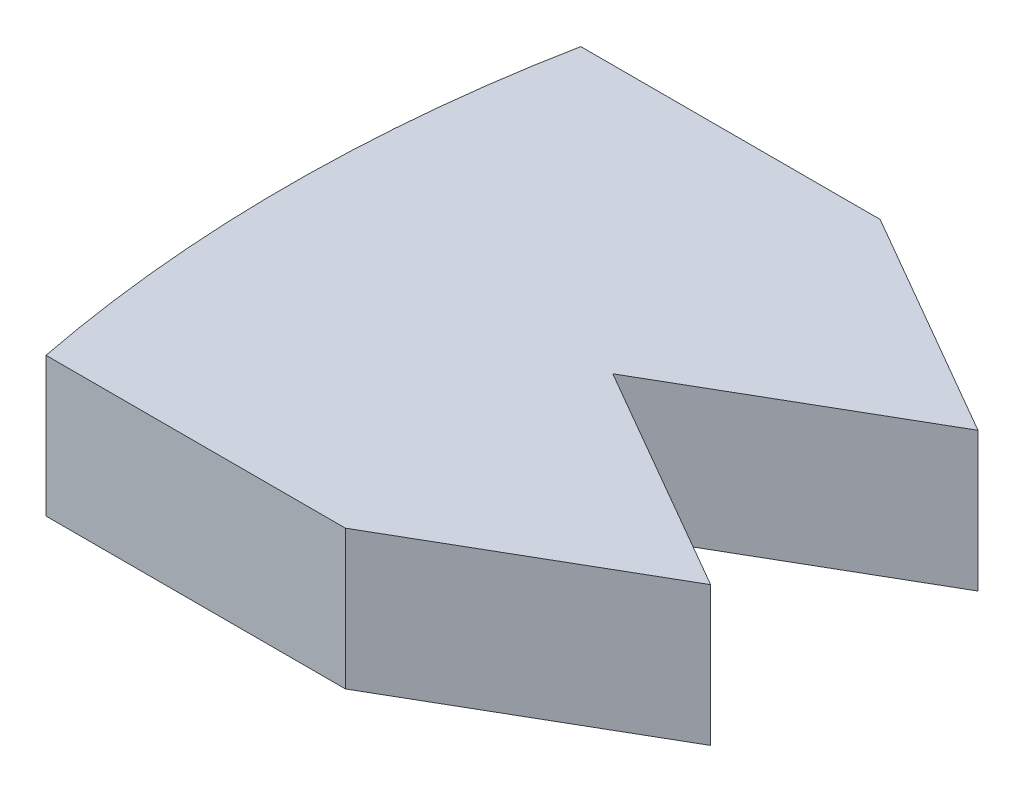
ISO-10303-21;
HEADER;
FILE_DESCRIPTION(('STEP AP214'),'2;1');
FILE_NAME('part.step','',(''),(''),'','','');
FILE_SCHEMA(('AUTOMOTIVE_DESIGN { 1 0 10303 214 1 1 1 1 }'));
ENDSEC;
DATA;
#1=APPLICATION_CONTEXT('core data for automotive mechanical design processes');
#2=APPLICATION_PROTOCOL_DEFINITION('international standard','automotive_design',2000,#1);
#3=PRODUCT_CONTEXT('',#1,'mechanical');
#4=PRODUCT('Part','Part','',(#3));
#5=PRODUCT_RELATED_PRODUCT_CATEGORY('part','',(#4));
#6=PRODUCT_DEFINITION_FORMATION('','',#4);
#7=PRODUCT_DEFINITION_CONTEXT('part definition',#1,'design');
#8=PRODUCT_DEFINITION('design','',#6,#7);
#9=PRODUCT_DEFINITION_SHAPE('','',#8);
#10=(LENGTH_UNIT() NAMED_UNIT(*) SI_UNIT(.MILLI.,.METRE.));
#11=(NAMED_UNIT(*) PLANE_ANGLE_UNIT() SI_UNIT($,.RADIAN.));
#12=(NAMED_UNIT(*) SI_UNIT($,.STERADIAN.) SOLID_ANGLE_UNIT());
#13=UNCERTAINTY_MEASURE_WITH_UNIT(LENGTH_MEASURE(1.E-05),#10,'distance_accuracy_value','');
#14=(GEOMETRIC_REPRESENTATION_CONTEXT(3) GLOBAL_UNCERTAINTY_ASSIGNED_CONTEXT((#13)) GLOBAL_UNIT_ASSIGNED_CONTEXT((#10,
#11,#12)) REPRESENTATION_CONTEXT('',''));
#15=CARTESIAN_POINT('',(0.,0.,0.));
#16=DIRECTION('',(0.,0.,1.));
#17=DIRECTION('',(1.,0.,0.));
#18=AXIS2_PLACEMENT_3D('',#15,#16,#17);
#19=CARTESIAN_POINT('',(-50.7501392498992,6.35,-9.49423866462424));
#20=DIRECTION('',(0.,0.,1.));
#21=DIRECTION('',(1.,0.,0.));
#22=AXIS2_PLACEMENT_3D('',#19,#20,#21);
#23=PLANE('',#22);
#24=DIRECTION('',(-1.,0.,0.));
#25=VECTOR('',#24,1.);
#26=CARTESIAN_POINT('',(-50.7501392498992,0.,-9.49423866462424));
#27=LINE('',#26,#25);
#28=CARTESIAN_POINT('',(-50.7501392498992,0.,-9.49423866462424));
#29=VERTEX_POINT('',#28);
#30=CARTESIAN_POINT('',(-64.4026392498992,0.,-9.49423866462425));
#31=VERTEX_POINT('',#30);
#32=EDGE_CURVE('E129',#29,#31,#27,.T.);
#33=ORIENTED_EDGE('',*,*,#32,.T.);
#34=DIRECTION('',(0.,-1.,0.));
#35=VECTOR('',#34,1.);
#36=CARTESIAN_POINT('',(-64.4026392498992,6.35,-9.49423866462425));
#37=LINE('',#36,#35);
#38=CARTESIAN_POINT('',(-64.4026392498992,6.35,-9.49423866462425));
#39=VERTEX_POINT('',#38);
#40=EDGE_CURVE('E11',#39,#31,#37,.T.);
#41=ORIENTED_EDGE('',*,*,#40,.F.);
#42=DIRECTION('',(-1.,0.,0.));
#43=VECTOR('',#42,1.);
#44=CARTESIAN_POINT('',(-50.7501392498992,6.35,-9.49423866462424));
#45=LINE('',#44,#43);
#46=CARTESIAN_POINT('',(-50.7501392498992,6.35,-9.49423866462424));
#47=VERTEX_POINT('',#46);
#48=EDGE_CURVE('E141',#47,#39,#45,.T.);
#49=ORIENTED_EDGE('',*,*,#48,.F.);
#50=DIRECTION('',(0.,-1.,0.));
#51=VECTOR('',#50,1.);
#52=CARTESIAN_POINT('',(-50.7501392498992,6.35,-9.49423866462424));
#53=LINE('',#52,#51);
#54=EDGE_CURVE('E124',#47,#29,#53,.T.);
#55=ORIENTED_EDGE('',*,*,#54,.T.);
#56=EDGE_LOOP('',(#33,#41,#49,#55));
#57=FACE_BOUND('',#56,.T.);
#58=ADVANCED_FACE('F39',(#57),#23,.F.);
#59=CARTESIAN_POINT('',(-2.08406147408657,6.35,2.69776133537576));
#60=DIRECTION('',(0.,-1.,0.));
#61=DIRECTION('',(0.,0.,-1.));
#62=AXIS2_PLACEMENT_3D('',#59,#60,#61);
#63=CYLINDRICAL_SURFACE('',#62,63.5);
#64=CARTESIAN_POINT('',(-2.08406147408657,0.,2.69776133537576));
#65=DIRECTION('',(0.,1.,0.));
#66=DIRECTION('',(0.,0.,1.));
#67=AXIS2_PLACEMENT_3D('',#64,#65,#66);
#68=CIRCLE('',#67,63.5);
#69=CARTESIAN_POINT('',(-64.4026392498992,0.,14.8897613353758));
#70=VERTEX_POINT('',#69);
#71=EDGE_CURVE('E135',#31,#70,#68,.T.);
#72=ORIENTED_EDGE('',*,*,#71,.T.);
#73=DIRECTION('',(0.,-1.,0.));
#74=VECTOR('',#73,1.);
#75=CARTESIAN_POINT('',(-64.4026392498992,6.35,14.8897613353758));
#76=LINE('',#75,#74);
#77=CARTESIAN_POINT('',(-64.4026392498992,6.35,14.8897613353758));
#78=VERTEX_POINT('',#77);
#79=EDGE_CURVE('E50',#78,#70,#76,.T.);
#80=ORIENTED_EDGE('',*,*,#79,.F.);
#81=CARTESIAN_POINT('',(-2.08406147408657,6.35,2.69776133537576));
#82=DIRECTION('',(0.,1.,0.));
#83=DIRECTION('',(0.,0.,1.));
#84=AXIS2_PLACEMENT_3D('',#81,#82,#83);
#85=CIRCLE('',#84,63.5);
#86=EDGE_CURVE('E94',#39,#78,#85,.T.);
#87=ORIENTED_EDGE('',*,*,#86,.F.);
#88=ORIENTED_EDGE('',*,*,#40,.T.);
#89=EDGE_LOOP('',(#72,#80,#87,#88));
#90=FACE_BOUND('',#89,.T.);
#91=ADVANCED_FACE('F168',(#90),#63,.T.);
#92=CARTESIAN_POINT('',(-50.7501392498992,6.35,14.8897613353758));
#93=DIRECTION('',(0.,0.,-1.));
#94=DIRECTION('',(-1.,0.,0.));
#95=AXIS2_PLACEMENT_3D('',#92,#93,#94);
#96=PLANE('',#95);
#97=DIRECTION('',(1.,0.,0.));
#98=VECTOR('',#97,1.);
#99=CARTESIAN_POINT('',(-50.7501392498992,0.,14.8897613353758));
#100=LINE('',#99,#98);
#101=CARTESIAN_POINT('',(-50.7501392498992,0.,14.8897613353758));
#102=VERTEX_POINT('',#101);
#103=EDGE_CURVE('E132',#70,#102,#100,.T.);
#104=ORIENTED_EDGE('',*,*,#103,.T.);
#105=DIRECTION('',(0.,-1.,0.));
#106=VECTOR('',#105,1.);
#107=CARTESIAN_POINT('',(-50.7501392498992,6.35,14.8897613353758));
#108=LINE('',#107,#106);
#109=CARTESIAN_POINT('',(-50.7501392498992,6.35,14.8897613353758));
#110=VERTEX_POINT('',#109);
#111=EDGE_CURVE('E144',#110,#102,#108,.T.);
#112=ORIENTED_EDGE('',*,*,#111,.F.);
#113=DIRECTION('',(1.,0.,0.));
#114=VECTOR('',#113,1.);
#115=CARTESIAN_POINT('',(-50.7501392498992,6.35,14.8897613353758));
#116=LINE('',#115,#114);
#117=EDGE_CURVE('E151',#78,#110,#116,.T.);
#118=ORIENTED_EDGE('',*,*,#117,.F.);
#119=ORIENTED_EDGE('',*,*,#79,.T.);
#120=EDGE_LOOP('',(#104,#112,#118,#119));
#121=FACE_BOUND('',#120,.T.);
#122=ADVANCED_FACE('F153',(#121),#96,.F.);
#123=CARTESIAN_POINT('',(-40.1915575269593,6.35,8.79376133537576));
#124=DIRECTION('',(-0.5,0.,-0.866025403784439));
#125=DIRECTION('',(-0.866025403784439,0.,0.5));
#126=AXIS2_PLACEMENT_3D('',#123,#124,#125);
#127=PLANE('',#126);
#128=DIRECTION('',(0.866025403784439,0.,-0.5));
#129=VECTOR('',#128,1.);
#130=CARTESIAN_POINT('',(-40.1915575269593,0.,8.79376133537576));
#131=LINE('',#130,#129);
#132=CARTESIAN_POINT('',(-40.1915575269593,0.,8.79376133537576));
#133=VERTEX_POINT('',#132);
#134=EDGE_CURVE('E136',#102,#133,#131,.T.);
#135=ORIENTED_EDGE('',*,*,#134,.T.);
#136=DIRECTION('',(0.,-1.,0.));
#137=VECTOR('',#136,1.);
#138=CARTESIAN_POINT('',(-40.1915575269593,6.35,8.79376133537576));
#139=LINE('',#138,#137);
#140=CARTESIAN_POINT('',(-40.1915575269593,6.35,8.79376133537576));
#141=VERTEX_POINT('',#140);
#142=EDGE_CURVE('E119',#141,#133,#139,.T.);
#143=ORIENTED_EDGE('',*,*,#142,.F.);
#144=DIRECTION('',(0.866025403784439,0.,-0.5));
#145=VECTOR('',#144,1.);
#146=CARTESIAN_POINT('',(-40.1915575269593,6.35,8.79376133537576));
#147=LINE('',#146,#145);
#148=EDGE_CURVE('E112',#110,#141,#147,.T.);
#149=ORIENTED_EDGE('',*,*,#148,.F.);
#150=ORIENTED_EDGE('',*,*,#111,.T.);
#151=EDGE_LOOP('',(#135,#143,#149,#150));
#152=FACE_BOUND('',#151,.T.);
#153=ADVANCED_FACE('F159',(#152),#127,.F.);
#154=CARTESIAN_POINT('',(-50.7501392498992,6.35,2.69776133537576));
#155=DIRECTION('',(-0.5,0.,0.866025403784439));
#156=DIRECTION('',(0.866025403784439,0.,0.5));
#157=AXIS2_PLACEMENT_3D('',#154,#155,#156);
#158=PLANE('',#157);
#159=DIRECTION('',(-0.866025403784439,0.,-0.5));
#160=VECTOR('',#159,1.);
#161=CARTESIAN_POINT('',(-50.7501392498992,0.,2.69776133537576));
#162=LINE('',#161,#160);
#163=CARTESIAN_POINT('',(-50.7501392498992,0.,2.69776133537576));
#164=VERTEX_POINT('',#163);
#165=EDGE_CURVE('E117',#133,#164,#162,.T.);
#166=ORIENTED_EDGE('',*,*,#165,.T.);
#167=DIRECTION('',(0.,-1.,0.));
#168=VECTOR('',#167,1.);
#169=CARTESIAN_POINT('',(-50.7501392498992,6.35,2.69776133537576));
#170=LINE('',#169,#168);
#171=CARTESIAN_POINT('',(-50.7501392498992,6.35,2.69776133537576));
#172=VERTEX_POINT('',#171);
#173=EDGE_CURVE('E118',#172,#164,#170,.T.);
#174=ORIENTED_EDGE('',*,*,#173,.F.);
#175=DIRECTION('',(-0.866025403784439,0.,-0.5));
#176=VECTOR('',#175,1.);
#177=CARTESIAN_POINT('',(-50.7501392498992,6.35,2.69776133537576));
#178=LINE('',#177,#176);
#179=EDGE_CURVE('E103',#141,#172,#178,.T.);
#180=ORIENTED_EDGE('',*,*,#179,.F.);
#181=ORIENTED_EDGE('',*,*,#142,.T.);
#182=EDGE_LOOP('',(#166,#174,#180,#181));
#183=FACE_BOUND('',#182,.T.);
#184=ADVANCED_FACE('F120',(#183),#158,.F.);
#185=CARTESIAN_POINT('',(-40.1915575269593,6.35,-3.39823866462424));
#186=DIRECTION('',(-0.5,0.,-0.866025403784439));
#187=DIRECTION('',(-0.866025403784439,0.,0.5));
#188=AXIS2_PLACEMENT_3D('',#185,#186,#187);
#189=PLANE('',#188);
#190=DIRECTION('',(0.866025403784438,0.,-0.5));
#191=VECTOR('',#190,1.);
#192=CARTESIAN_POINT('',(-40.1915575269593,0.,-3.39823866462424));
#193=LINE('',#192,#191);
#194=CARTESIAN_POINT('',(-40.1915575269593,0.,-3.39823866462424));
#195=VERTEX_POINT('',#194);
#196=EDGE_CURVE('E83',#164,#195,#193,.T.);
#197=ORIENTED_EDGE('',*,*,#196,.T.);
#198=DIRECTION('',(0.,-1.,0.));
#199=VECTOR('',#198,1.);
#200=CARTESIAN_POINT('',(-40.1915575269593,6.35,-3.39823866462424));
#201=LINE('',#200,#199);
#202=CARTESIAN_POINT('',(-40.1915575269593,6.35,-3.39823866462424));
#203=VERTEX_POINT('',#202);
#204=EDGE_CURVE('E123',#203,#195,#201,.T.);
#205=ORIENTED_EDGE('',*,*,#204,.F.);
#206=DIRECTION('',(0.866025403784438,0.,-0.5));
#207=VECTOR('',#206,1.);
#208=CARTESIAN_POINT('',(-40.1915575269593,6.35,-3.39823866462424));
#209=LINE('',#208,#207);
#210=EDGE_CURVE('E107',#172,#203,#209,.T.);
#211=ORIENTED_EDGE('',*,*,#210,.F.);
#212=ORIENTED_EDGE('',*,*,#173,.T.);
#213=EDGE_LOOP('',(#197,#205,#211,#212));
#214=FACE_BOUND('',#213,.T.);
#215=ADVANCED_FACE('F121',(#214),#189,.F.);
#216=CARTESIAN_POINT('',(-50.7501392498992,6.35,-9.49423866462424));
#217=DIRECTION('',(-0.5,0.,0.866025403784439));
#218=DIRECTION('',(0.866025403784439,0.,0.5));
#219=AXIS2_PLACEMENT_3D('',#216,#217,#218);
#220=PLANE('',#219);
#221=DIRECTION('',(-0.866025403784438,0.,-0.5));
#222=VECTOR('',#221,1.);
#223=CARTESIAN_POINT('',(-50.7501392498992,0.,-9.49423866462424));
#224=LINE('',#223,#222);
#225=EDGE_CURVE('E90',#195,#29,#224,.T.);
#226=ORIENTED_EDGE('',*,*,#225,.T.);
#227=ORIENTED_EDGE('',*,*,#54,.F.);
#228=DIRECTION('',(-0.866025403784438,0.,-0.5));
#229=VECTOR('',#228,1.);
#230=CARTESIAN_POINT('',(-50.7501392498992,6.35,-9.49423866462424));
#231=LINE('',#230,#229);
#232=EDGE_CURVE('E54',#203,#47,#231,.T.);
#233=ORIENTED_EDGE('',*,*,#232,.F.);
#234=ORIENTED_EDGE('',*,*,#204,.T.);
#235=EDGE_LOOP('',(#226,#227,#233,#234));
#236=FACE_BOUND('',#235,.T.);
#237=ADVANCED_FACE('F179',(#236),#220,.F.);
#238=CARTESIAN_POINT('',(-2.08406147408657,6.35,2.69776133537576));
#239=DIRECTION('',(0.,1.,0.));
#240=DIRECTION('',(0.,0.,1.));
#241=AXIS2_PLACEMENT_3D('',#238,#239,#240);
#242=PLANE('',#241);
#243=ORIENTED_EDGE('',*,*,#48,.T.);
#244=ORIENTED_EDGE('',*,*,#86,.T.);
#245=ORIENTED_EDGE('',*,*,#117,.T.);
#246=ORIENTED_EDGE('',*,*,#148,.T.);
#247=ORIENTED_EDGE('',*,*,#179,.T.);
#248=ORIENTED_EDGE('',*,*,#210,.T.);
#249=ORIENTED_EDGE('',*,*,#232,.T.);
#250=EDGE_LOOP('',(#243,#244,#245,#246,#247,#248,#249));
#251=FACE_BOUND('',#250,.T.);
#252=ADVANCED_FACE('F110',(#251),#242,.T.);
#253=CARTESIAN_POINT('',(-2.08406147408657,0.,2.69776133537576));
#254=DIRECTION('',(0.,1.,0.));
#255=DIRECTION('',(0.,0.,1.));
#256=AXIS2_PLACEMENT_3D('',#253,#254,#255);
#257=PLANE('',#256);
#258=ORIENTED_EDGE('',*,*,#32,.F.);
#259=ORIENTED_EDGE('',*,*,#225,.F.);
#260=ORIENTED_EDGE('',*,*,#196,.F.);
#261=ORIENTED_EDGE('',*,*,#165,.F.);
#262=ORIENTED_EDGE('',*,*,#134,.F.);
#263=ORIENTED_EDGE('',*,*,#103,.F.);
#264=ORIENTED_EDGE('',*,*,#71,.F.);
#265=EDGE_LOOP('',(#258,#259,#260,#261,#262,#263,#264));
#266=FACE_BOUND('',#265,.T.);
#267=ADVANCED_FACE('F160',(#266),#257,.F.);
#268=CLOSED_SHELL('',(#58,#91,#122,#153,#184,#215,#237,#252,#267));
#269=MANIFOLD_SOLID_BREP('B2',#268);
#270=ADVANCED_BREP_SHAPE_REPRESENTATION('',(#18,#269),#14);
#271=SHAPE_DEFINITION_REPRESENTATION(#9,#270);
ENDSEC;
END-ISO-10303-21;
